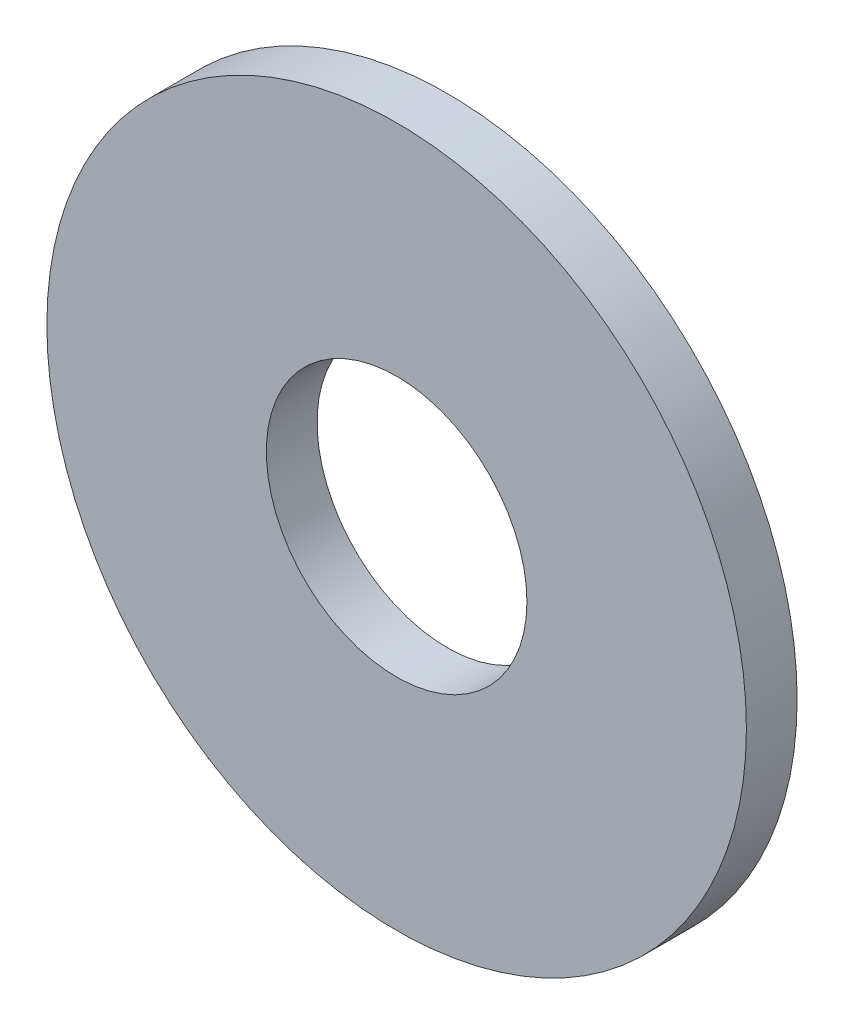
ISO-10303-21;
HEADER;
FILE_DESCRIPTION(('STEP AP214'),'2;1');
FILE_NAME('part.step','',(''),(''),'','','');
FILE_SCHEMA(('AUTOMOTIVE_DESIGN { 1 0 10303 214 1 1 1 1 }'));
ENDSEC;
DATA;
#1=APPLICATION_CONTEXT('core data for automotive mechanical design processes');
#2=APPLICATION_PROTOCOL_DEFINITION('international standard','automotive_design',2000,#1);
#3=PRODUCT_CONTEXT('',#1,'mechanical');
#4=PRODUCT('Part','Part','',(#3));
#5=PRODUCT_RELATED_PRODUCT_CATEGORY('part','',(#4));
#6=PRODUCT_DEFINITION_FORMATION('','',#4);
#7=PRODUCT_DEFINITION_CONTEXT('part definition',#1,'design');
#8=PRODUCT_DEFINITION('design','',#6,#7);
#9=PRODUCT_DEFINITION_SHAPE('','',#8);
#10=(LENGTH_UNIT() NAMED_UNIT(*) SI_UNIT(.MILLI.,.METRE.));
#11=(NAMED_UNIT(*) PLANE_ANGLE_UNIT() SI_UNIT($,.RADIAN.));
#12=(NAMED_UNIT(*) SI_UNIT($,.STERADIAN.) SOLID_ANGLE_UNIT());
#13=UNCERTAINTY_MEASURE_WITH_UNIT(LENGTH_MEASURE(1.E-05),#10,'distance_accuracy_value','');
#14=(GEOMETRIC_REPRESENTATION_CONTEXT(3) GLOBAL_UNCERTAINTY_ASSIGNED_CONTEXT((#13)) GLOBAL_UNIT_ASSIGNED_CONTEXT((#10,
#11,#12)) REPRESENTATION_CONTEXT('',''));
#15=CARTESIAN_POINT('',(0.,0.,0.));
#16=DIRECTION('',(0.,0.,1.));
#17=DIRECTION('',(1.,0.,0.));
#18=AXIS2_PLACEMENT_3D('',#15,#16,#17);
#19=CARTESIAN_POINT('',(0.,0.,2.9));
#20=DIRECTION('',(0.,0.,1.));
#21=DIRECTION('',(1.,0.,0.));
#22=AXIS2_PLACEMENT_3D('',#19,#20,#21);
#23=PLANE('',#22);
#24=CARTESIAN_POINT('',(0.,0.,2.9));
#25=DIRECTION('',(0.,0.,1.));
#26=DIRECTION('',(1.,0.,0.));
#27=AXIS2_PLACEMENT_3D('',#24,#25,#26);
#28=CIRCLE('',#27,20.);
#29=CARTESIAN_POINT('',(20.,0.,2.9));
#30=VERTEX_POINT('',#29);
#31=EDGE_CURVE('E11',#30,#30,#28,.T.);
#32=ORIENTED_EDGE('',*,*,#31,.T.);
#33=EDGE_LOOP('',(#32));
#34=FACE_BOUND('',#33,.T.);
#35=CARTESIAN_POINT('',(0.,0.,2.9));
#36=DIRECTION('',(0.,0.,1.));
#37=DIRECTION('',(1.,0.,0.));
#38=AXIS2_PLACEMENT_3D('',#35,#36,#37);
#39=CIRCLE('',#38,7.45);
#40=CARTESIAN_POINT('',(7.45,0.,2.9));
#41=VERTEX_POINT('',#40);
#42=EDGE_CURVE('E62',#41,#41,#39,.T.);
#43=ORIENTED_EDGE('',*,*,#42,.F.);
#44=EDGE_LOOP('',(#43));
#45=FACE_BOUND('',#44,.T.);
#46=ADVANCED_FACE('F49',(#34,#45),#23,.T.);
#47=CARTESIAN_POINT('',(0.,0.,0.));
#48=DIRECTION('',(0.,0.,1.));
#49=DIRECTION('',(1.,0.,0.));
#50=AXIS2_PLACEMENT_3D('',#47,#48,#49);
#51=PLANE('',#50);
#52=CARTESIAN_POINT('',(0.,0.,0.));
#53=DIRECTION('',(0.,0.,1.));
#54=DIRECTION('',(1.,0.,0.));
#55=AXIS2_PLACEMENT_3D('',#52,#53,#54);
#56=CIRCLE('',#55,20.);
#57=CARTESIAN_POINT('',(20.,0.,0.));
#58=VERTEX_POINT('',#57);
#59=EDGE_CURVE('E53',#58,#58,#56,.T.);
#60=ORIENTED_EDGE('',*,*,#59,.F.);
#61=EDGE_LOOP('',(#60));
#62=FACE_BOUND('',#61,.T.);
#63=CARTESIAN_POINT('',(0.,0.,0.));
#64=DIRECTION('',(0.,0.,1.));
#65=DIRECTION('',(1.,0.,0.));
#66=AXIS2_PLACEMENT_3D('',#63,#64,#65);
#67=CIRCLE('',#66,7.45);
#68=CARTESIAN_POINT('',(7.45,0.,0.));
#69=VERTEX_POINT('',#68);
#70=EDGE_CURVE('E64',#69,#69,#67,.T.);
#71=ORIENTED_EDGE('',*,*,#70,.T.);
#72=EDGE_LOOP('',(#71));
#73=FACE_BOUND('',#72,.T.);
#74=ADVANCED_FACE('F76',(#62,#73),#51,.F.);
#75=CARTESIAN_POINT('',(0.,0.,2.9));
#76=DIRECTION('',(0.,0.,-1.));
#77=DIRECTION('',(-1.,0.,0.));
#78=AXIS2_PLACEMENT_3D('',#75,#76,#77);
#79=CYLINDRICAL_SURFACE('',#78,20.);
#80=ORIENTED_EDGE('',*,*,#31,.F.);
#81=EDGE_LOOP('',(#80));
#82=FACE_BOUND('',#81,.T.);
#83=ORIENTED_EDGE('',*,*,#59,.T.);
#84=EDGE_LOOP('',(#83));
#85=FACE_BOUND('',#84,.T.);
#86=ADVANCED_FACE('F51',(#82,#85),#79,.T.);
#87=CARTESIAN_POINT('',(0.,0.,2.9));
#88=DIRECTION('',(0.,0.,-1.));
#89=DIRECTION('',(-1.,0.,0.));
#90=AXIS2_PLACEMENT_3D('',#87,#88,#89);
#91=CYLINDRICAL_SURFACE('',#90,7.45);
#92=ORIENTED_EDGE('',*,*,#42,.T.);
#93=EDGE_LOOP('',(#92));
#94=FACE_BOUND('',#93,.T.);
#95=ORIENTED_EDGE('',*,*,#70,.F.);
#96=EDGE_LOOP('',(#95));
#97=FACE_BOUND('',#96,.T.);
#98=ADVANCED_FACE('F72',(#94,#97),#91,.F.);
#99=CLOSED_SHELL('',(#46,#74,#86,#98));
#100=MANIFOLD_SOLID_BREP('B2',#99);
#101=ADVANCED_BREP_SHAPE_REPRESENTATION('',(#18,#100),#14);
#102=SHAPE_DEFINITION_REPRESENTATION(#9,#101);
ENDSEC;
END-ISO-10303-21;
